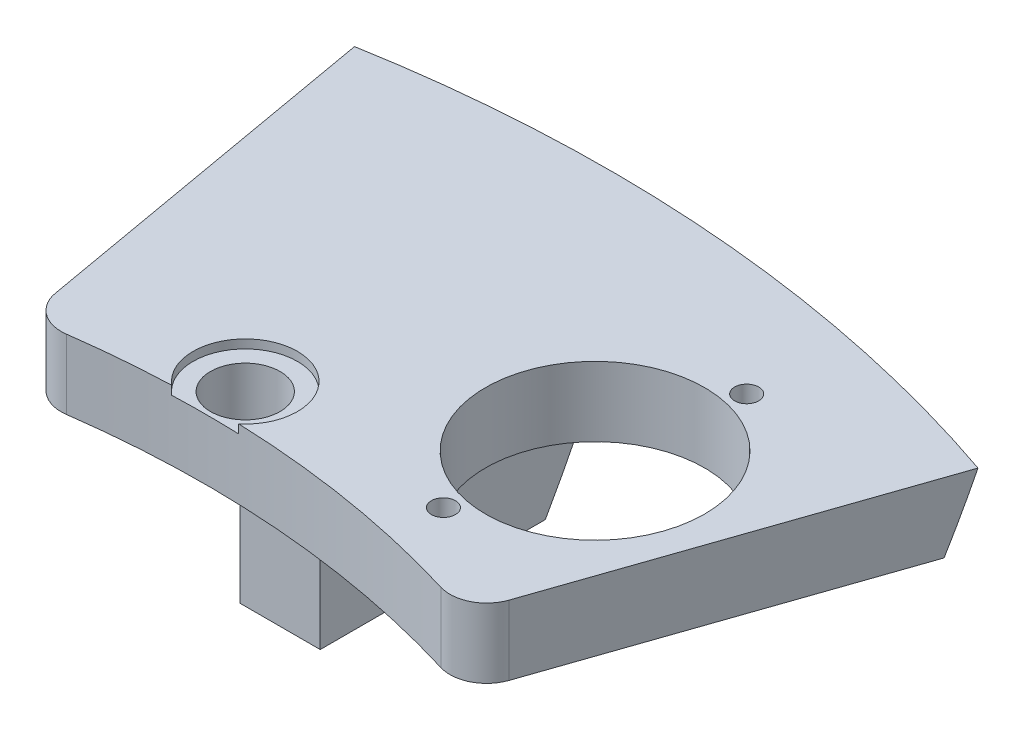
ISO-10303-21;
HEADER;
FILE_DESCRIPTION(('STEP AP214'),'2;1');
FILE_NAME('part.step','',(''),(''),'','','');
FILE_SCHEMA(('AUTOMOTIVE_DESIGN { 1 0 10303 214 1 1 1 1 }'));
ENDSEC;
DATA;
#1=APPLICATION_CONTEXT('core data for automotive mechanical design processes');
#2=APPLICATION_PROTOCOL_DEFINITION('international standard','automotive_design',2000,#1);
#3=PRODUCT_CONTEXT('',#1,'mechanical');
#4=PRODUCT('Part','Part','',(#3));
#5=PRODUCT_RELATED_PRODUCT_CATEGORY('part','',(#4));
#6=PRODUCT_DEFINITION_FORMATION('','',#4);
#7=PRODUCT_DEFINITION_CONTEXT('part definition',#1,'design');
#8=PRODUCT_DEFINITION('design','',#6,#7);
#9=PRODUCT_DEFINITION_SHAPE('','',#8);
#10=(LENGTH_UNIT() NAMED_UNIT(*) SI_UNIT(.MILLI.,.METRE.));
#11=(NAMED_UNIT(*) PLANE_ANGLE_UNIT() SI_UNIT($,.RADIAN.));
#12=(NAMED_UNIT(*) SI_UNIT($,.STERADIAN.) SOLID_ANGLE_UNIT());
#13=UNCERTAINTY_MEASURE_WITH_UNIT(LENGTH_MEASURE(1.E-05),#10,'distance_accuracy_value','');
#14=(GEOMETRIC_REPRESENTATION_CONTEXT(3) GLOBAL_UNCERTAINTY_ASSIGNED_CONTEXT((#13)) GLOBAL_UNIT_ASSIGNED_CONTEXT((#10,
#11,#12)) REPRESENTATION_CONTEXT('',''));
#15=CARTESIAN_POINT('',(0.,0.,0.));
#16=DIRECTION('',(0.,0.,1.));
#17=DIRECTION('',(1.,0.,0.));
#18=AXIS2_PLACEMENT_3D('',#15,#16,#17);
#19=CARTESIAN_POINT('',(0.,-200000.,-6.99440505513849E-10));
#20=DIRECTION('',(0.,-1.,0.));
#21=DIRECTION('',(0.,0.,-1.));
#22=AXIS2_PLACEMENT_3D('',#19,#20,#21);
#23=CYLINDRICAL_SURFACE('',#22,130.175000000074);
#24=CARTESIAN_POINT('',(0.,23.2127777778146,0.));
#25=DIRECTION('',(0.,-1.,0.));
#26=DIRECTION('',(0.,0.,-1.));
#27=AXIS2_PLACEMENT_3D('',#24,#25,#26);
#28=CIRCLE('',#27,130.175000000074);
#29=CARTESIAN_POINT('',(-17.8472794150398,23.2127777778151,-128.945745344702));
#30=VERTEX_POINT('',#29);
#31=CARTESIAN_POINT('',(-4.58561549758568,23.2127777778003,-130.094207232787));
#32=VERTEX_POINT('',#31);
#33=EDGE_CURVE('E200',#30,#32,#28,.T.);
#34=ORIENTED_EDGE('',*,*,#33,.F.);
#35=DIRECTION('',(0.,-1.,0.));
#36=VECTOR('',#35,1.);
#37=CARTESIAN_POINT('',(-17.8472794150398,-200000.,-128.945745345401));
#38=LINE('',#37,#36);
#39=CARTESIAN_POINT('',(-17.8472794150398,13.6877777777902,-128.945745344702));
#40=VERTEX_POINT('',#39);
#41=EDGE_CURVE('E229',#30,#40,#38,.T.);
#42=ORIENTED_EDGE('',*,*,#41,.T.);
#43=CARTESIAN_POINT('',(0.,13.6877777777897,0.));
#44=DIRECTION('',(0.,-1.,0.));
#45=DIRECTION('',(0.,0.,-1.));
#46=AXIS2_PLACEMENT_3D('',#43,#44,#45);
#47=CIRCLE('',#46,130.175000000074);
#48=CARTESIAN_POINT('',(37.7991084826106,13.6877777777902,-124.566279638347));
#49=VERTEX_POINT('',#48);
#50=EDGE_CURVE('E212',#40,#49,#47,.T.);
#51=ORIENTED_EDGE('',*,*,#50,.T.);
#52=DIRECTION('',(0.,-1.,0.));
#53=VECTOR('',#52,1.);
#54=CARTESIAN_POINT('',(37.7991084826106,-200000.,-124.566279639047));
#55=LINE('',#54,#53);
#56=CARTESIAN_POINT('',(37.7991084826106,23.212777777815,-124.566279638347));
#57=VERTEX_POINT('',#56);
#58=EDGE_CURVE('E226',#49,#57,#55,.F.);
#59=ORIENTED_EDGE('',*,*,#58,.T.);
#60=CARTESIAN_POINT('',(4.5856154975856,23.2127777778013,-130.094207232787));
#61=VERTEX_POINT('',#60);
#62=EDGE_CURVE('E199',#61,#57,#28,.T.);
#63=ORIENTED_EDGE('',*,*,#62,.F.);
#64=DIRECTION('',(0.,1.,0.));
#65=VECTOR('',#64,1.);
#66=CARTESIAN_POINT('',(4.58561549758589,22.6174777778003,-130.094207232787));
#67=LINE('',#66,#65);
#68=CARTESIAN_POINT('',(4.58561549758575,22.0221777778008,-130.094207232787));
#69=VERTEX_POINT('',#68);
#70=EDGE_CURVE('E182',#69,#61,#67,.T.);
#71=ORIENTED_EDGE('',*,*,#70,.F.);
#72=CARTESIAN_POINT('',(0.,22.0221777778136,0.));
#73=DIRECTION('',(0.,1.,0.));
#74=DIRECTION('',(-1.,0.,0.));
#75=AXIS2_PLACEMENT_3D('',#72,#73,#74);
#76=CIRCLE('',#75,130.175000000074);
#77=CARTESIAN_POINT('',(-4.58561549758575,22.0221777778008,-130.094207232787));
#78=VERTEX_POINT('',#77);
#79=EDGE_CURVE('E223',#69,#78,#76,.T.);
#80=ORIENTED_EDGE('',*,*,#79,.T.);
#81=DIRECTION('',(0.,1.,0.));
#82=VECTOR('',#81,1.);
#83=CARTESIAN_POINT('',(-4.58561549758588,22.6174777778003,-130.094207232787));
#84=LINE('',#83,#82);
#85=EDGE_CURVE('E180',#32,#78,#84,.F.);
#86=ORIENTED_EDGE('',*,*,#85,.F.);
#87=EDGE_LOOP('',(#34,#42,#51,#59,#63,#71,#80,#86));
#88=FACE_BOUND('',#87,.T.);
#89=ADVANCED_FACE('F42',(#88),#23,.F.);
#90=CARTESIAN_POINT('',(-22.6046515278055,13.6877777778008,-128.197349248437));
#91=DIRECTION('',(0.,-1.,0.));
#92=DIRECTION('',(0.,0.,-1.));
#93=AXIS2_PLACEMENT_3D('',#90,#91,#92);
#94=PLANE('',#93);
#95=CARTESIAN_POINT('',(35.7971953665631,13.6877777778009,-168.412563156415));
#96=DIRECTION('',(0.,-1.,0.));
#97=DIRECTION('',(0.,0.,-1.));
#98=AXIS2_PLACEMENT_3D('',#95,#96,#97);
#99=CIRCLE('',#98,1.65);
#100=CARTESIAN_POINT('',(35.7971953665631,13.6877777778009,-170.062563156415));
#101=VERTEX_POINT('',#100);
#102=EDGE_CURVE('E445',#101,#101,#99,.T.);
#103=ORIENTED_EDGE('',*,*,#102,.F.);
#104=EDGE_LOOP('',(#103));
#105=FACE_BOUND('',#104,.T.);
#106=CARTESIAN_POINT('',(28.5202861879415,13.6877777778008,-134.177397130732));
#107=DIRECTION('',(0.,-1.,0.));
#108=DIRECTION('',(0.,0.,-1.));
#109=AXIS2_PLACEMENT_3D('',#106,#107,#108);
#110=CIRCLE('',#109,1.65);
#111=CARTESIAN_POINT('',(28.5202861879415,13.6877777778008,-135.827397130732));
#112=VERTEX_POINT('',#111);
#113=EDGE_CURVE('E262',#112,#112,#110,.T.);
#114=ORIENTED_EDGE('',*,*,#113,.F.);
#115=EDGE_LOOP('',(#114));
#116=FACE_BOUND('',#115,.T.);
#117=DIRECTION('',(0.,0.,1.));
#118=VECTOR('',#117,1.);
#119=CARTESIAN_POINT('',(5.5,13.6877777778004,-140.334416112493));
#120=LINE('',#119,#118);
#121=CARTESIAN_POINT('',(5.50000000000001,13.6877777777897,-181.83521384436));
#122=VERTEX_POINT('',#121);
#123=CARTESIAN_POINT('',(5.5,13.6877777778004,-140.334416112493));
#124=VERTEX_POINT('',#123);
#125=EDGE_CURVE('E250',#122,#124,#120,.T.);
#126=ORIENTED_EDGE('',*,*,#125,.F.);
#127=CARTESIAN_POINT('',(0.,13.6877777777897,0.));
#128=DIRECTION('',(0.,-1.,0.));
#129=DIRECTION('',(0.,0.,-1.));
#130=AXIS2_PLACEMENT_3D('',#127,#128,#129);
#131=CIRCLE('',#130,181.91837453601);
#132=CARTESIAN_POINT('',(59.2268294595348,13.6877777778009,-172.007202366631));
#133=VERTEX_POINT('',#132);
#134=EDGE_CURVE('E207',#122,#133,#131,.T.);
#135=ORIENTED_EDGE('',*,*,#134,.T.);
#136=DIRECTION('',(0.325568154457158,0.,-0.945518575599317));
#137=VECTOR('',#136,1.);
#138=CARTESIAN_POINT('',(0.,13.6877777778003,1.7191772794765E-13));
#139=LINE('',#138,#137);
#140=CARTESIAN_POINT('',(43.9785588010029,13.6877777778008,-127.723008854378));
#141=VERTEX_POINT('',#140);
#142=EDGE_CURVE('E184',#141,#133,#139,.T.);
#143=ORIENTED_EDGE('',*,*,#142,.F.);
#144=CARTESIAN_POINT('',(39.250965923847,13.6877777777897,-129.350849626374));
#145=DIRECTION('',(0.,-1.,0.));
#146=DIRECTION('',(0.,0.,-1.));
#147=AXIS2_PLACEMENT_3D('',#144,#145,#146);
#148=CIRCLE('',#147,5.);
#149=EDGE_CURVE('E233',#141,#49,#148,.T.);
#150=ORIENTED_EDGE('',*,*,#149,.T.);
#151=ORIENTED_EDGE('',*,*,#50,.F.);
#152=CARTESIAN_POINT('',(-18.5327904353981,13.6877777777897,-133.898529878776));
#153=DIRECTION('',(0.,-1.,0.));
#154=DIRECTION('',(0.,0.,-1.));
#155=AXIS2_PLACEMENT_3D('',#152,#153,#154);
#156=CIRCLE('',#155,5.);
#157=CARTESIAN_POINT('',(-23.4568292004591,13.6877777778009,-133.030288990441));
#158=VERTEX_POINT('',#157);
#159=EDGE_CURVE('E235',#40,#158,#156,.T.);
#160=ORIENTED_EDGE('',*,*,#159,.T.);
#161=DIRECTION('',(-0.173648177666931,0.,-0.984807753012208));
#162=VECTOR('',#161,1.);
#163=CARTESIAN_POINT('',(-22.6046515278055,13.6877777778009,-128.197349248437));
#164=LINE('',#163,#162);
#165=CARTESIAN_POINT('',(-31.5897942223083,13.6877777778009,-179.154625658441));
#166=VERTEX_POINT('',#165);
#167=EDGE_CURVE('E187',#158,#166,#164,.T.);
#168=ORIENTED_EDGE('',*,*,#167,.T.);
#169=CARTESIAN_POINT('',(-5.49999999999999,13.6877777778003,-181.83521384436));
#170=VERTEX_POINT('',#169);
#171=EDGE_CURVE('E208',#166,#170,#131,.T.);
#172=ORIENTED_EDGE('',*,*,#171,.T.);
#173=DIRECTION('',(0.,0.,-1.));
#174=VECTOR('',#173,1.);
#175=CARTESIAN_POINT('',(-5.5,13.6877777778003,-140.334416112493));
#176=LINE('',#175,#174);
#177=CARTESIAN_POINT('',(-5.5,13.6877777778003,-140.334416112493));
#178=VERTEX_POINT('',#177);
#179=EDGE_CURVE('E154',#178,#170,#176,.T.);
#180=ORIENTED_EDGE('',*,*,#179,.F.);
#181=DIRECTION('',(-1.,0.,0.));
#182=VECTOR('',#181,1.);
#183=CARTESIAN_POINT('',(-5.5,13.6877777778003,-140.334416112493));
#184=LINE('',#183,#182);
#185=CARTESIAN_POINT('',(0.,13.6877777778006,-140.334416112493));
#186=VERTEX_POINT('',#185);
#187=EDGE_CURVE('E159',#186,#178,#184,.T.);
#188=ORIENTED_EDGE('',*,*,#187,.F.);
#189=CARTESIAN_POINT('',(0.,13.6877777778006,-135.571916112493));
#190=DIRECTION('',(0.,1.,0.));
#191=DIRECTION('',(-1.,0.,0.));
#192=AXIS2_PLACEMENT_3D('',#189,#190,#191);
#193=CIRCLE('',#192,4.76249999999999);
#194=EDGE_CURVE('E172',#186,#186,#193,.T.);
#195=ORIENTED_EDGE('',*,*,#194,.T.);
#196=EDGE_CURVE('E260',#124,#186,#184,.T.);
#197=ORIENTED_EDGE('',*,*,#196,.F.);
#198=EDGE_LOOP('',(#126,#135,#143,#150,#151,#160,#168,#172,#180,#188,#195,#197));
#199=FACE_BOUND('',#198,.T.);
#200=CARTESIAN_POINT('',(32.1587407772524,13.6877777778005,-151.294980143573));
#201=DIRECTION('',(0.,-1.,0.));
#202=DIRECTION('',(1.,0.,0.));
#203=AXIS2_PLACEMENT_3D('',#200,#201,#202);
#204=CIRCLE('',#203,15.);
#205=CARTESIAN_POINT('',(47.1587407772524,13.6877777778005,-151.294980143573));
#206=VERTEX_POINT('',#205);
#207=EDGE_CURVE('E160',#206,#206,#204,.T.);
#208=ORIENTED_EDGE('',*,*,#207,.F.);
#209=EDGE_LOOP('',(#208));
#210=FACE_BOUND('',#209,.T.);
#211=ADVANCED_FACE('F266',(#105,#116,#199,#210),#94,.T.);
#212=CARTESIAN_POINT('',(0.,88.8916839674127,0.));
#213=DIRECTION('',(0.,-1.,0.));
#214=DIRECTION('',(-0.173648177666931,0.,-0.984807753012208));
#215=AXIS2_PLACEMENT_3D('',#212,#213,#214);
#216=SPHERICAL_SURFACE('',#215,196.85);
#217=CARTESIAN_POINT('',(0.,23.2127777778146,0.));
#218=DIRECTION('',(0.,-1.,0.));
#219=DIRECTION('',(0.,0.,-1.));
#220=AXIS2_PLACEMENT_3D('',#217,#218,#219);
#221=CIRCLE('',#220,185.569943098919);
#222=CARTESIAN_POINT('',(-32.2238824488834,23.2127777778007,-182.75071868985));
#223=VERTEX_POINT('',#222);
#224=CARTESIAN_POINT('',(60.4156638974349,23.2127777778005,-175.459828272936));
#225=VERTEX_POINT('',#224);
#226=EDGE_CURVE('E203',#223,#225,#221,.T.);
#227=ORIENTED_EDGE('',*,*,#226,.T.);
#228=CARTESIAN_POINT('',(-2.06570076133018E-13,88.8916839674127,0.));
#229=DIRECTION('',(0.945518575599317,0.,0.325568154457158));
#230=DIRECTION('',(0.325568154457158,0.,-0.945518575599317));
#231=AXIS2_PLACEMENT_3D('',#228,#229,#230);
#232=CIRCLE('',#231,196.85);
#233=EDGE_CURVE('E217',#225,#133,#232,.F.);
#234=ORIENTED_EDGE('',*,*,#233,.T.);
#235=ORIENTED_EDGE('',*,*,#134,.F.);
#236=CARTESIAN_POINT('',(5.49999999999972,88.8916839674127,0.));
#237=DIRECTION('',(-1.,0.,0.));
#238=DIRECTION('',(0.,-1.,0.));
#239=AXIS2_PLACEMENT_3D('',#236,#237,#238);
#240=CIRCLE('',#239,196.773149845196);
#241=CARTESIAN_POINT('',(5.50000000000008,-8.20222222219965,-171.150360446137));
#242=VERTEX_POINT('',#241);
#243=EDGE_CURVE('E248',#122,#242,#240,.T.);
#244=ORIENTED_EDGE('',*,*,#243,.T.);
#245=CARTESIAN_POINT('',(2.82879762071173E-13,-8.20222222219967,0.));
#246=DIRECTION('',(0.,1.,0.));
#247=DIRECTION('',(-1.,0.,0.));
#248=AXIS2_PLACEMENT_3D('',#245,#246,#247);
#249=CIRCLE('',#248,171.238710228858);
#250=CARTESIAN_POINT('',(-5.49999999999992,-8.20222222219968,-171.150360446137));
#251=VERTEX_POINT('',#250);
#252=EDGE_CURVE('E51',#242,#251,#249,.T.);
#253=ORIENTED_EDGE('',*,*,#252,.T.);
#254=CARTESIAN_POINT('',(-5.50000000000028,88.8916839674127,0.));
#255=DIRECTION('',(1.,0.,0.));
#256=DIRECTION('',(0.,1.,0.));
#257=AXIS2_PLACEMENT_3D('',#254,#255,#256);
#258=CIRCLE('',#257,196.773149845196);
#259=EDGE_CURVE('E11',#251,#170,#258,.T.);
#260=ORIENTED_EDGE('',*,*,#259,.T.);
#261=CARTESIAN_POINT('',(0.,13.6877777777904,-181.91837453601));
#262=VERTEX_POINT('',#261);
#263=EDGE_CURVE('E213',#170,#262,#131,.T.);
#264=ORIENTED_EDGE('',*,*,#263,.T.);
#265=ORIENTED_EDGE('',*,*,#263,.F.);
#266=ORIENTED_EDGE('',*,*,#171,.F.);
#267=CARTESIAN_POINT('',(0.,88.8916839674127,0.));
#268=DIRECTION('',(0.984807753012208,0.,-0.173648177666931));
#269=DIRECTION('',(-0.173648177666931,0.,-0.984807753012208));
#270=AXIS2_PLACEMENT_3D('',#267,#268,#269);
#271=CIRCLE('',#270,196.85);
#272=EDGE_CURVE('E192',#166,#223,#271,.T.);
#273=ORIENTED_EDGE('',*,*,#272,.T.);
#274=EDGE_LOOP('',(#227,#234,#235,#244,#253,#260,#264,#265,#266,#273));
#275=FACE_BOUND('',#274,.T.);
#276=ADVANCED_FACE('F252',(#275),#216,.T.);
#277=CARTESIAN_POINT('',(-22.6046515278055,23.2127777778007,-128.197349248437));
#278=DIRECTION('',(0.,1.,0.));
#279=DIRECTION('',(0.,0.,1.));
#280=AXIS2_PLACEMENT_3D('',#277,#278,#279);
#281=PLANE('',#280);
#282=CARTESIAN_POINT('',(35.7971953665631,23.2127777778004,-168.412563156415));
#283=DIRECTION('',(0.,1.,0.));
#284=DIRECTION('',(0.,0.,1.));
#285=AXIS2_PLACEMENT_3D('',#282,#283,#284);
#286=CIRCLE('',#285,1.65);
#287=CARTESIAN_POINT('',(35.7971953665631,23.2127777778004,-166.762563156415));
#288=VERTEX_POINT('',#287);
#289=EDGE_CURVE('E448',#288,#288,#286,.T.);
#290=ORIENTED_EDGE('',*,*,#289,.F.);
#291=EDGE_LOOP('',(#290));
#292=FACE_BOUND('',#291,.T.);
#293=CARTESIAN_POINT('',(28.5202861879415,23.2127777778004,-134.177397130732));
#294=DIRECTION('',(0.,1.,0.));
#295=DIRECTION('',(0.,0.,1.));
#296=AXIS2_PLACEMENT_3D('',#293,#294,#295);
#297=CIRCLE('',#296,1.65);
#298=CARTESIAN_POINT('',(28.5202861879415,23.2127777778004,-132.527397130732));
#299=VERTEX_POINT('',#298);
#300=EDGE_CURVE('E450',#299,#299,#297,.T.);
#301=ORIENTED_EDGE('',*,*,#300,.F.);
#302=EDGE_LOOP('',(#301));
#303=FACE_BOUND('',#302,.T.);
#304=CARTESIAN_POINT('',(32.1587407772524,23.2127777778011,-151.294980143573));
#305=DIRECTION('',(0.,-1.,0.));
#306=DIRECTION('',(1.,0.,0.));
#307=AXIS2_PLACEMENT_3D('',#304,#305,#306);
#308=CIRCLE('',#307,15.);
#309=CARTESIAN_POINT('',(47.1587407772524,23.2127777778012,-151.294980143573));
#310=VERTEX_POINT('',#309);
#311=EDGE_CURVE('E164',#310,#310,#308,.T.);
#312=ORIENTED_EDGE('',*,*,#311,.T.);
#313=EDGE_LOOP('',(#312));
#314=FACE_BOUND('',#313,.T.);
#315=DIRECTION('',(0.173648177666931,0.,0.984807753012208));
#316=VECTOR('',#315,1.);
#317=CARTESIAN_POINT('',(-22.6046515278055,23.2127777778009,-128.197349248437));
#318=LINE('',#317,#316);
#319=CARTESIAN_POINT('',(-23.4568292004591,23.2127777778009,-133.030288990441));
#320=VERTEX_POINT('',#319);
#321=EDGE_CURVE('E195',#223,#320,#318,.T.);
#322=ORIENTED_EDGE('',*,*,#321,.T.);
#323=CARTESIAN_POINT('',(-18.5327904353981,23.2127777778146,-133.898529878776));
#324=DIRECTION('',(0.,1.,0.));
#325=DIRECTION('',(0.,0.,1.));
#326=AXIS2_PLACEMENT_3D('',#323,#324,#325);
#327=CIRCLE('',#326,5.);
#328=EDGE_CURVE('E243',#320,#30,#327,.T.);
#329=ORIENTED_EDGE('',*,*,#328,.T.);
#330=ORIENTED_EDGE('',*,*,#33,.T.);
#331=CARTESIAN_POINT('',(0.,23.2127777778007,-135.571916112493));
#332=DIRECTION('',(0.,1.,0.));
#333=DIRECTION('',(0.,0.,1.));
#334=AXIS2_PLACEMENT_3D('',#331,#332,#333);
#335=CIRCLE('',#334,7.14375);
#336=EDGE_CURVE('E220',#61,#32,#335,.T.);
#337=ORIENTED_EDGE('',*,*,#336,.F.);
#338=ORIENTED_EDGE('',*,*,#62,.T.);
#339=CARTESIAN_POINT('',(39.250965923847,23.2127777778146,-129.350849626374));
#340=DIRECTION('',(0.,1.,0.));
#341=DIRECTION('',(0.,0.,1.));
#342=AXIS2_PLACEMENT_3D('',#339,#340,#341);
#343=CIRCLE('',#342,5.);
#344=CARTESIAN_POINT('',(43.9785588010029,23.2127777778004,-127.723008854378));
#345=VERTEX_POINT('',#344);
#346=EDGE_CURVE('E241',#57,#345,#343,.T.);
#347=ORIENTED_EDGE('',*,*,#346,.T.);
#348=DIRECTION('',(0.325568154457158,0.,-0.945518575599317));
#349=VECTOR('',#348,1.);
#350=CARTESIAN_POINT('',(0.,23.2127777778003,0.));
#351=LINE('',#350,#349);
#352=EDGE_CURVE('E185',#345,#225,#351,.T.);
#353=ORIENTED_EDGE('',*,*,#352,.T.);
#354=ORIENTED_EDGE('',*,*,#226,.F.);
#355=EDGE_LOOP('',(#322,#329,#330,#337,#338,#347,#353,#354));
#356=FACE_BOUND('',#355,.T.);
#357=ADVANCED_FACE('F292',(#292,#303,#314,#356),#281,.T.);
#358=CARTESIAN_POINT('',(0.,88.8916839674127,0.));
#359=DIRECTION('',(0.984807753012208,0.,-0.173648177666931));
#360=DIRECTION('',(-0.173648177666931,0.,-0.984807753012208));
#361=AXIS2_PLACEMENT_3D('',#358,#359,#360);
#362=PLANE('',#361);
#363=ORIENTED_EDGE('',*,*,#167,.F.);
#364=DIRECTION('',(0.,1.,0.));
#365=VECTOR('',#364,1.);
#366=CARTESIAN_POINT('',(-23.4568292004591,23.2127777778146,-133.030288990441));
#367=LINE('',#366,#365);
#368=EDGE_CURVE('E238',#158,#320,#367,.T.);
#369=ORIENTED_EDGE('',*,*,#368,.T.);
#370=ORIENTED_EDGE('',*,*,#321,.F.);
#371=ORIENTED_EDGE('',*,*,#272,.F.);
#372=EDGE_LOOP('',(#363,#369,#370,#371));
#373=FACE_BOUND('',#372,.T.);
#374=ADVANCED_FACE('F303',(#373),#362,.F.);
#375=CARTESIAN_POINT('',(2.77674277683162E-13,-56.9516132251901,0.));
#376=DIRECTION('',(0.945518575599317,0.,0.325568154457158));
#377=DIRECTION('',(0.325568154457158,0.,-0.945518575599317));
#378=AXIS2_PLACEMENT_3D('',#375,#376,#377);
#379=PLANE('',#378);
#380=ORIENTED_EDGE('',*,*,#352,.F.);
#381=DIRECTION('',(0.,-1.,0.));
#382=VECTOR('',#381,1.);
#383=CARTESIAN_POINT('',(43.9785588010032,-56.9516132251896,-127.723008854378));
#384=LINE('',#383,#382);
#385=EDGE_CURVE('E246',#345,#141,#384,.T.);
#386=ORIENTED_EDGE('',*,*,#385,.T.);
#387=ORIENTED_EDGE('',*,*,#142,.T.);
#388=ORIENTED_EDGE('',*,*,#233,.F.);
#389=EDGE_LOOP('',(#380,#386,#387,#388));
#390=FACE_BOUND('',#389,.T.);
#391=ADVANCED_FACE('F313',(#390),#379,.T.);
#392=CARTESIAN_POINT('',(0.,22.0221777778003,-135.571916112493));
#393=DIRECTION('',(0.,1.,0.));
#394=DIRECTION('',(-1.,0.,0.));
#395=AXIS2_PLACEMENT_3D('',#392,#393,#394);
#396=CYLINDRICAL_SURFACE('',#395,7.14375);
#397=ORIENTED_EDGE('',*,*,#70,.T.);
#398=ORIENTED_EDGE('',*,*,#336,.T.);
#399=ORIENTED_EDGE('',*,*,#85,.T.);
#400=CARTESIAN_POINT('',(0.,22.0221777778003,-135.571916112493));
#401=DIRECTION('',(0.,1.,0.));
#402=DIRECTION('',(-1.,0.,0.));
#403=AXIS2_PLACEMENT_3D('',#400,#401,#402);
#404=CIRCLE('',#403,7.14375);
#405=EDGE_CURVE('E175',#69,#78,#404,.T.);
#406=ORIENTED_EDGE('',*,*,#405,.F.);
#407=EDGE_LOOP('',(#397,#398,#399,#406));
#408=FACE_BOUND('',#407,.T.);
#409=ADVANCED_FACE('F280',(#408),#396,.F.);
#410=CARTESIAN_POINT('',(0.,22.0221777778003,-135.571916112493));
#411=DIRECTION('',(0.,1.,0.));
#412=DIRECTION('',(-1.,0.,0.));
#413=AXIS2_PLACEMENT_3D('',#410,#411,#412);
#414=PLANE('',#413);
#415=CARTESIAN_POINT('',(0.,22.0221777778003,-135.571916112493));
#416=DIRECTION('',(0.,1.,0.));
#417=DIRECTION('',(-1.,0.,0.));
#418=AXIS2_PLACEMENT_3D('',#415,#416,#417);
#419=CIRCLE('',#418,4.76249999999999);
#420=CARTESIAN_POINT('',(-4.76249999999999,22.0221777778003,-135.571916112493));
#421=VERTEX_POINT('',#420);
#422=EDGE_CURVE('E170',#421,#421,#419,.T.);
#423=ORIENTED_EDGE('',*,*,#422,.F.);
#424=EDGE_LOOP('',(#423));
#425=FACE_BOUND('',#424,.T.);
#426=ORIENTED_EDGE('',*,*,#405,.T.);
#427=ORIENTED_EDGE('',*,*,#79,.F.);
#428=EDGE_LOOP('',(#426,#427));
#429=FACE_BOUND('',#428,.T.);
#430=ADVANCED_FACE('F274',(#425,#429),#414,.T.);
#431=CARTESIAN_POINT('',(0.,13.6877777778006,-135.571916112493));
#432=DIRECTION('',(0.,1.,0.));
#433=DIRECTION('',(-1.,0.,0.));
#434=AXIS2_PLACEMENT_3D('',#431,#432,#433);
#435=CYLINDRICAL_SURFACE('',#434,4.76249999999999);
#436=ORIENTED_EDGE('',*,*,#194,.F.);
#437=EDGE_LOOP('',(#436));
#438=FACE_BOUND('',#437,.T.);
#439=ORIENTED_EDGE('',*,*,#422,.T.);
#440=EDGE_LOOP('',(#439));
#441=FACE_BOUND('',#440,.T.);
#442=ADVANCED_FACE('F270',(#438,#441),#435,.F.);
#443=CARTESIAN_POINT('',(32.1587407772524,23.2127777778011,-151.294980143573));
#444=DIRECTION('',(0.,-1.,0.));
#445=DIRECTION('',(1.,0.,0.));
#446=AXIS2_PLACEMENT_3D('',#443,#444,#445);
#447=CYLINDRICAL_SURFACE('',#446,15.);
#448=ORIENTED_EDGE('',*,*,#311,.F.);
#449=EDGE_LOOP('',(#448));
#450=FACE_BOUND('',#449,.T.);
#451=ORIENTED_EDGE('',*,*,#207,.T.);
#452=EDGE_LOOP('',(#451));
#453=FACE_BOUND('',#452,.T.);
#454=ADVANCED_FACE('F273',(#450,#453),#447,.F.);
#455=CARTESIAN_POINT('',(-18.5327904353981,-200000.,-133.898529879476));
#456=DIRECTION('',(0.,-1.,0.));
#457=DIRECTION('',(0.,0.,-1.));
#458=AXIS2_PLACEMENT_3D('',#455,#456,#457);
#459=CYLINDRICAL_SURFACE('',#458,5.);
#460=ORIENTED_EDGE('',*,*,#328,.F.);
#461=ORIENTED_EDGE('',*,*,#368,.F.);
#462=ORIENTED_EDGE('',*,*,#159,.F.);
#463=ORIENTED_EDGE('',*,*,#41,.F.);
#464=EDGE_LOOP('',(#460,#461,#462,#463));
#465=FACE_BOUND('',#464,.T.);
#466=ADVANCED_FACE('F297',(#465),#459,.T.);
#467=CARTESIAN_POINT('',(39.250965923847,-200000.,-129.350849627074));
#468=DIRECTION('',(0.,-1.,0.));
#469=DIRECTION('',(0.,0.,-1.));
#470=AXIS2_PLACEMENT_3D('',#467,#468,#469);
#471=CYLINDRICAL_SURFACE('',#470,5.);
#472=ORIENTED_EDGE('',*,*,#149,.F.);
#473=ORIENTED_EDGE('',*,*,#385,.F.);
#474=ORIENTED_EDGE('',*,*,#346,.F.);
#475=ORIENTED_EDGE('',*,*,#58,.F.);
#476=EDGE_LOOP('',(#472,#473,#474,#475));
#477=FACE_BOUND('',#476,.T.);
#478=ADVANCED_FACE('F44',(#477),#471,.T.);
#479=CARTESIAN_POINT('',(-5.49999999999992,-8.20222222219968,-140.334416112493));
#480=DIRECTION('',(0.,0.,-1.));
#481=DIRECTION('',(-1.,0.,0.));
#482=AXIS2_PLACEMENT_3D('',#479,#480,#481);
#483=PLANE('',#482);
#484=ORIENTED_EDGE('',*,*,#196,.T.);
#485=ORIENTED_EDGE('',*,*,#187,.T.);
#486=DIRECTION('',(0.,1.,0.));
#487=VECTOR('',#486,1.);
#488=CARTESIAN_POINT('',(-5.49999999999992,-8.20222222219968,-140.334416112493));
#489=LINE('',#488,#487);
#490=CARTESIAN_POINT('',(-5.49999999999992,-8.20222222219968,-140.334416112493));
#491=VERTEX_POINT('',#490);
#492=EDGE_CURVE('E144',#491,#178,#489,.T.);
#493=ORIENTED_EDGE('',*,*,#492,.F.);
#494=DIRECTION('',(-1.,0.,0.));
#495=VECTOR('',#494,1.);
#496=CARTESIAN_POINT('',(-5.49999999999992,-8.20222222219968,-140.334416112493));
#497=LINE('',#496,#495);
#498=CARTESIAN_POINT('',(5.50000000000008,-8.20222222219965,-140.334416112493));
#499=VERTEX_POINT('',#498);
#500=EDGE_CURVE('E146',#499,#491,#497,.T.);
#501=ORIENTED_EDGE('',*,*,#500,.F.);
#502=DIRECTION('',(0.,1.,0.));
#503=VECTOR('',#502,1.);
#504=CARTESIAN_POINT('',(5.50000000000008,-8.20222222219965,-140.334416112493));
#505=LINE('',#504,#503);
#506=EDGE_CURVE('E161',#499,#124,#505,.T.);
#507=ORIENTED_EDGE('',*,*,#506,.T.);
#508=EDGE_LOOP('',(#484,#485,#493,#501,#507));
#509=FACE_BOUND('',#508,.T.);
#510=ADVANCED_FACE('F158',(#509),#483,.F.);
#511=CARTESIAN_POINT('',(-5.49999999999992,-8.20222222219968,-140.334416112493));
#512=DIRECTION('',(1.,0.,0.));
#513=DIRECTION('',(0.,1.,0.));
#514=AXIS2_PLACEMENT_3D('',#511,#512,#513);
#515=PLANE('',#514);
#516=ORIENTED_EDGE('',*,*,#179,.T.);
#517=ORIENTED_EDGE('',*,*,#259,.F.);
#518=DIRECTION('',(0.,0.,-1.));
#519=VECTOR('',#518,1.);
#520=CARTESIAN_POINT('',(-5.49999999999992,-8.20222222219968,-140.334416112493));
#521=LINE('',#520,#519);
#522=EDGE_CURVE('E140',#491,#251,#521,.T.);
#523=ORIENTED_EDGE('',*,*,#522,.F.);
#524=ORIENTED_EDGE('',*,*,#492,.T.);
#525=EDGE_LOOP('',(#516,#517,#523,#524));
#526=FACE_BOUND('',#525,.T.);
#527=ADVANCED_FACE('F142',(#526),#515,.F.);
#528=CARTESIAN_POINT('',(5.50000000000008,-8.20222222219965,-140.334416112493));
#529=DIRECTION('',(-1.,0.,0.));
#530=DIRECTION('',(0.,-1.,0.));
#531=AXIS2_PLACEMENT_3D('',#528,#529,#530);
#532=PLANE('',#531);
#533=DIRECTION('',(0.,0.,1.));
#534=VECTOR('',#533,1.);
#535=CARTESIAN_POINT('',(5.50000000000008,-8.20222222219965,-140.334416112493));
#536=LINE('',#535,#534);
#537=EDGE_CURVE('E145',#242,#499,#536,.T.);
#538=ORIENTED_EDGE('',*,*,#537,.F.);
#539=ORIENTED_EDGE('',*,*,#243,.F.);
#540=ORIENTED_EDGE('',*,*,#125,.T.);
#541=ORIENTED_EDGE('',*,*,#506,.F.);
#542=EDGE_LOOP('',(#538,#539,#540,#541));
#543=FACE_BOUND('',#542,.T.);
#544=ADVANCED_FACE('F257',(#543),#532,.F.);
#545=CARTESIAN_POINT('',(0.,-8.20222222219967,0.));
#546=DIRECTION('',(0.,1.,0.));
#547=DIRECTION('',(-1.,0.,0.));
#548=AXIS2_PLACEMENT_3D('',#545,#546,#547);
#549=PLANE('',#548);
#550=ORIENTED_EDGE('',*,*,#500,.T.);
#551=ORIENTED_EDGE('',*,*,#522,.T.);
#552=ORIENTED_EDGE('',*,*,#252,.F.);
#553=ORIENTED_EDGE('',*,*,#537,.T.);
#554=EDGE_LOOP('',(#550,#551,#552,#553));
#555=FACE_BOUND('',#554,.T.);
#556=ADVANCED_FACE('F149',(#555),#549,.F.);
#557=CARTESIAN_POINT('',(28.5202861879415,23.2127777778004,-134.177397130732));
#558=DIRECTION('',(0.,1.,0.));
#559=DIRECTION('',(0.,0.,1.));
#560=AXIS2_PLACEMENT_3D('',#557,#558,#559);
#561=CYLINDRICAL_SURFACE('',#560,1.65);
#562=ORIENTED_EDGE('',*,*,#113,.T.);
#563=EDGE_LOOP('',(#562));
#564=FACE_BOUND('',#563,.T.);
#565=ORIENTED_EDGE('',*,*,#300,.T.);
#566=EDGE_LOOP('',(#565));
#567=FACE_BOUND('',#566,.T.);
#568=ADVANCED_FACE('F414',(#564,#567),#561,.F.);
#569=CARTESIAN_POINT('',(35.7971953665631,23.2127777778004,-168.412563156415));
#570=DIRECTION('',(0.,1.,0.));
#571=DIRECTION('',(0.,0.,1.));
#572=AXIS2_PLACEMENT_3D('',#569,#570,#571);
#573=CYLINDRICAL_SURFACE('',#572,1.65);
#574=ORIENTED_EDGE('',*,*,#102,.T.);
#575=EDGE_LOOP('',(#574));
#576=FACE_BOUND('',#575,.T.);
#577=ORIENTED_EDGE('',*,*,#289,.T.);
#578=EDGE_LOOP('',(#577));
#579=FACE_BOUND('',#578,.T.);
#580=ADVANCED_FACE('F421',(#576,#579),#573,.F.);
#581=CLOSED_SHELL('',(#89,#211,#276,#357,#374,#391,#409,#430,#442,#454,#466,#478,#510,#527,#544,
#556,#568,#580));
#582=MANIFOLD_SOLID_BREP('B2',#581);
#583=ADVANCED_BREP_SHAPE_REPRESENTATION('',(#18,#582),#14);
#584=SHAPE_DEFINITION_REPRESENTATION(#9,#583);
ENDSEC;
END-ISO-10303-21;
